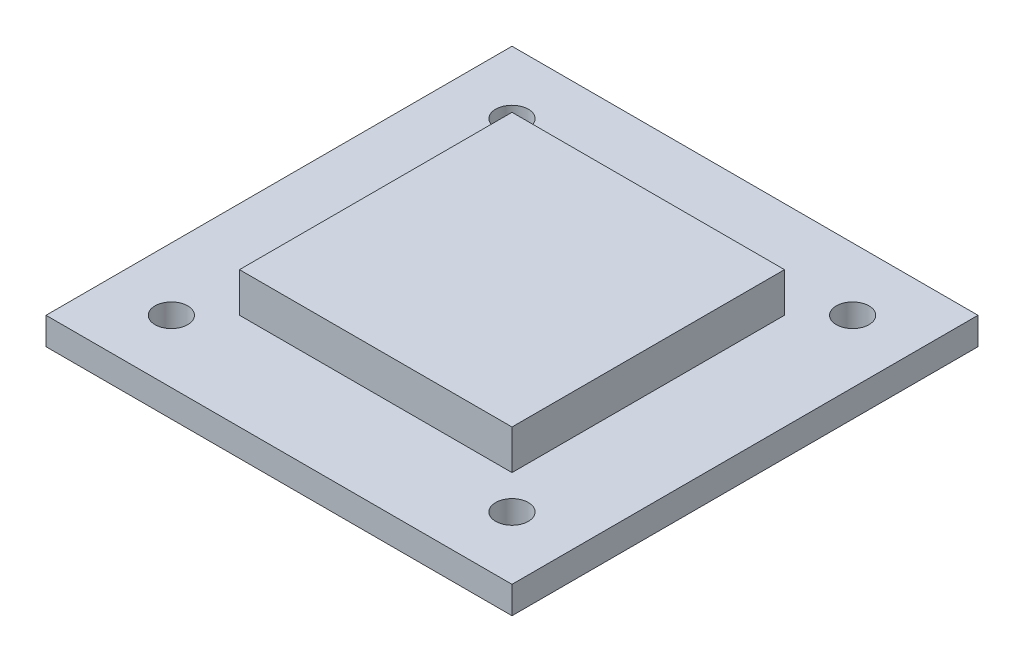
ISO-10303-21;
HEADER;
FILE_DESCRIPTION(('STEP AP214'),'2;1');
FILE_NAME('part.step','',(''),(''),'','','');
FILE_SCHEMA(('AUTOMOTIVE_DESIGN { 1 0 10303 214 1 1 1 1 }'));
ENDSEC;
DATA;
#1=APPLICATION_CONTEXT('core data for automotive mechanical design processes');
#2=APPLICATION_PROTOCOL_DEFINITION('international standard','automotive_design',2000,#1);
#3=PRODUCT_CONTEXT('',#1,'mechanical');
#4=PRODUCT('Part','Part','',(#3));
#5=PRODUCT_RELATED_PRODUCT_CATEGORY('part','',(#4));
#6=PRODUCT_DEFINITION_FORMATION('','',#4);
#7=PRODUCT_DEFINITION_CONTEXT('part definition',#1,'design');
#8=PRODUCT_DEFINITION('design','',#6,#7);
#9=PRODUCT_DEFINITION_SHAPE('','',#8);
#10=(LENGTH_UNIT() NAMED_UNIT(*) SI_UNIT(.MILLI.,.METRE.));
#11=(NAMED_UNIT(*) PLANE_ANGLE_UNIT() SI_UNIT($,.RADIAN.));
#12=(NAMED_UNIT(*) SI_UNIT($,.STERADIAN.) SOLID_ANGLE_UNIT());
#13=UNCERTAINTY_MEASURE_WITH_UNIT(LENGTH_MEASURE(1.E-05),#10,'distance_accuracy_value','');
#14=(GEOMETRIC_REPRESENTATION_CONTEXT(3) GLOBAL_UNCERTAINTY_ASSIGNED_CONTEXT((#13)) GLOBAL_UNIT_ASSIGNED_CONTEXT((#10,
#11,#12)) REPRESENTATION_CONTEXT('',''));
#15=CARTESIAN_POINT('',(0.,0.,0.));
#16=DIRECTION('',(0.,0.,1.));
#17=DIRECTION('',(1.,0.,0.));
#18=AXIS2_PLACEMENT_3D('',#15,#16,#17);
#19=CARTESIAN_POINT('',(-12.5,3.9,12.5));
#20=DIRECTION('',(0.,1.,0.));
#21=DIRECTION('',(0.,0.,1.));
#22=AXIS2_PLACEMENT_3D('',#19,#20,#21);
#23=CYLINDRICAL_SURFACE('',#22,1.19999999999999);
#24=CARTESIAN_POINT('',(-12.5,-1.,12.5));
#25=DIRECTION('',(0.,1.,0.));
#26=DIRECTION('',(0.,0.,1.));
#27=AXIS2_PLACEMENT_3D('',#24,#25,#26);
#28=CIRCLE('',#27,1.19999999999999);
#29=CARTESIAN_POINT('',(-12.5,-1.,13.7));
#30=VERTEX_POINT('',#29);
#31=EDGE_CURVE('E245',#30,#30,#28,.F.);
#32=ORIENTED_EDGE('',*,*,#31,.T.);
#33=EDGE_LOOP('',(#32));
#34=FACE_BOUND('',#33,.T.);
#35=CARTESIAN_POINT('',(-12.5,1.,12.5));
#36=DIRECTION('',(0.,1.,0.));
#37=DIRECTION('',(0.,0.,1.));
#38=AXIS2_PLACEMENT_3D('',#35,#36,#37);
#39=CIRCLE('',#38,1.19999999999999);
#40=CARTESIAN_POINT('',(-12.5,1.,13.7));
#41=VERTEX_POINT('',#40);
#42=EDGE_CURVE('E208',#41,#41,#39,.T.);
#43=ORIENTED_EDGE('',*,*,#42,.T.);
#44=EDGE_LOOP('',(#43));
#45=FACE_BOUND('',#44,.T.);
#46=ADVANCED_FACE('F41',(#34,#45),#23,.F.);
#47=CARTESIAN_POINT('',(12.5,3.9,-12.5));
#48=DIRECTION('',(0.,1.,0.));
#49=DIRECTION('',(0.,0.,1.));
#50=AXIS2_PLACEMENT_3D('',#47,#48,#49);
#51=CYLINDRICAL_SURFACE('',#50,1.19999999999999);
#52=CARTESIAN_POINT('',(12.5,-1.,-12.5));
#53=DIRECTION('',(0.,1.,0.));
#54=DIRECTION('',(0.,0.,1.));
#55=AXIS2_PLACEMENT_3D('',#52,#53,#54);
#56=CIRCLE('',#55,1.19999999999999);
#57=CARTESIAN_POINT('',(12.5,-1.,-11.3));
#58=VERTEX_POINT('',#57);
#59=EDGE_CURVE('E243',#58,#58,#56,.F.);
#60=ORIENTED_EDGE('',*,*,#59,.T.);
#61=EDGE_LOOP('',(#60));
#62=FACE_BOUND('',#61,.T.);
#63=CARTESIAN_POINT('',(12.5,1.,-12.5));
#64=DIRECTION('',(0.,1.,0.));
#65=DIRECTION('',(0.,0.,1.));
#66=AXIS2_PLACEMENT_3D('',#63,#64,#65);
#67=CIRCLE('',#66,1.19999999999999);
#68=CARTESIAN_POINT('',(12.5,1.,-11.3));
#69=VERTEX_POINT('',#68);
#70=EDGE_CURVE('E194',#69,#69,#67,.T.);
#71=ORIENTED_EDGE('',*,*,#70,.T.);
#72=EDGE_LOOP('',(#71));
#73=FACE_BOUND('',#72,.T.);
#74=ADVANCED_FACE('F267',(#62,#73),#51,.F.);
#75=CARTESIAN_POINT('',(12.5,3.9,12.5));
#76=DIRECTION('',(0.,1.,0.));
#77=DIRECTION('',(0.,0.,1.));
#78=AXIS2_PLACEMENT_3D('',#75,#76,#77);
#79=CYLINDRICAL_SURFACE('',#78,1.19999999999999);
#80=CARTESIAN_POINT('',(12.5,-1.,12.5));
#81=DIRECTION('',(0.,1.,0.));
#82=DIRECTION('',(0.,0.,1.));
#83=AXIS2_PLACEMENT_3D('',#80,#81,#82);
#84=CIRCLE('',#83,1.19999999999999);
#85=CARTESIAN_POINT('',(12.5,-1.,13.7));
#86=VERTEX_POINT('',#85);
#87=EDGE_CURVE('E143',#86,#86,#84,.F.);
#88=ORIENTED_EDGE('',*,*,#87,.T.);
#89=EDGE_LOOP('',(#88));
#90=FACE_BOUND('',#89,.T.);
#91=CARTESIAN_POINT('',(12.5,1.,12.5));
#92=DIRECTION('',(0.,1.,0.));
#93=DIRECTION('',(0.,0.,1.));
#94=AXIS2_PLACEMENT_3D('',#91,#92,#93);
#95=CIRCLE('',#94,1.19999999999999);
#96=CARTESIAN_POINT('',(12.5,1.,13.7));
#97=VERTEX_POINT('',#96);
#98=EDGE_CURVE('E211',#97,#97,#95,.T.);
#99=ORIENTED_EDGE('',*,*,#98,.T.);
#100=EDGE_LOOP('',(#99));
#101=FACE_BOUND('',#100,.T.);
#102=ADVANCED_FACE('F277',(#90,#101),#79,.F.);
#103=CARTESIAN_POINT('',(-12.5,3.9,-12.5));
#104=DIRECTION('',(0.,1.,0.));
#105=DIRECTION('',(0.,0.,1.));
#106=AXIS2_PLACEMENT_3D('',#103,#104,#105);
#107=CYLINDRICAL_SURFACE('',#106,1.19999999999999);
#108=CARTESIAN_POINT('',(-12.5,-1.,-12.5));
#109=DIRECTION('',(0.,1.,0.));
#110=DIRECTION('',(0.,0.,1.));
#111=AXIS2_PLACEMENT_3D('',#108,#109,#110);
#112=CIRCLE('',#111,1.19999999999999);
#113=CARTESIAN_POINT('',(-12.5,-1.,-11.3));
#114=VERTEX_POINT('',#113);
#115=EDGE_CURVE('E186',#114,#114,#112,.F.);
#116=ORIENTED_EDGE('',*,*,#115,.T.);
#117=EDGE_LOOP('',(#116));
#118=FACE_BOUND('',#117,.T.);
#119=CARTESIAN_POINT('',(-12.5,1.,-12.5));
#120=DIRECTION('',(0.,1.,0.));
#121=DIRECTION('',(0.,0.,1.));
#122=AXIS2_PLACEMENT_3D('',#119,#120,#121);
#123=CIRCLE('',#122,1.19999999999999);
#124=CARTESIAN_POINT('',(-12.5,1.,-11.3));
#125=VERTEX_POINT('',#124);
#126=EDGE_CURVE('E177',#125,#125,#123,.T.);
#127=ORIENTED_EDGE('',*,*,#126,.T.);
#128=EDGE_LOOP('',(#127));
#129=FACE_BOUND('',#128,.T.);
#130=ADVANCED_FACE('F322',(#118,#129),#107,.F.);
#131=CARTESIAN_POINT('',(17.1,3.9,-17.1));
#132=DIRECTION('',(-1.,0.,0.));
#133=DIRECTION('',(0.,0.,1.));
#134=AXIS2_PLACEMENT_3D('',#131,#132,#133);
#135=PLANE('',#134);
#136=DIRECTION('',(0.,-1.,0.));
#137=VECTOR('',#136,1.);
#138=CARTESIAN_POINT('',(17.1,3.9,17.1));
#139=LINE('',#138,#137);
#140=CARTESIAN_POINT('',(17.1,1.,17.1));
#141=VERTEX_POINT('',#140);
#142=CARTESIAN_POINT('',(17.1,-1.,17.1));
#143=VERTEX_POINT('',#142);
#144=EDGE_CURVE('E182',#141,#143,#139,.T.);
#145=ORIENTED_EDGE('',*,*,#144,.T.);
#146=DIRECTION('',(0.,0.,-1.));
#147=VECTOR('',#146,1.);
#148=CARTESIAN_POINT('',(17.1,-1.,0.));
#149=LINE('',#148,#147);
#150=CARTESIAN_POINT('',(17.1,-1.,-17.1));
#151=VERTEX_POINT('',#150);
#152=EDGE_CURVE('E57',#143,#151,#149,.T.);
#153=ORIENTED_EDGE('',*,*,#152,.T.);
#154=DIRECTION('',(0.,-1.,0.));
#155=VECTOR('',#154,1.);
#156=CARTESIAN_POINT('',(17.1,3.9,-17.1));
#157=LINE('',#156,#155);
#158=CARTESIAN_POINT('',(17.1,1.,-17.1));
#159=VERTEX_POINT('',#158);
#160=EDGE_CURVE('E12',#159,#151,#157,.T.);
#161=ORIENTED_EDGE('',*,*,#160,.F.);
#162=DIRECTION('',(0.,0.,1.));
#163=VECTOR('',#162,1.);
#164=CARTESIAN_POINT('',(17.1,1.,0.));
#165=LINE('',#164,#163);
#166=EDGE_CURVE('E202',#159,#141,#165,.T.);
#167=ORIENTED_EDGE('',*,*,#166,.T.);
#168=EDGE_LOOP('',(#145,#153,#161,#167));
#169=FACE_BOUND('',#168,.T.);
#170=ADVANCED_FACE('F43',(#169),#135,.F.);
#171=CARTESIAN_POINT('',(-17.1,3.9,-17.1));
#172=DIRECTION('',(0.,0.,1.));
#173=DIRECTION('',(1.,0.,0.));
#174=AXIS2_PLACEMENT_3D('',#171,#172,#173);
#175=PLANE('',#174);
#176=ORIENTED_EDGE('',*,*,#160,.T.);
#177=DIRECTION('',(-1.,0.,0.));
#178=VECTOR('',#177,1.);
#179=CARTESIAN_POINT('',(0.,-1.,-17.1));
#180=LINE('',#179,#178);
#181=CARTESIAN_POINT('',(-17.1,-1.,-17.1));
#182=VERTEX_POINT('',#181);
#183=EDGE_CURVE('E234',#151,#182,#180,.T.);
#184=ORIENTED_EDGE('',*,*,#183,.T.);
#185=DIRECTION('',(0.,-1.,0.));
#186=VECTOR('',#185,1.);
#187=CARTESIAN_POINT('',(-17.1,3.9,-17.1));
#188=LINE('',#187,#186);
#189=CARTESIAN_POINT('',(-17.1,1.,-17.1));
#190=VERTEX_POINT('',#189);
#191=EDGE_CURVE('E47',#190,#182,#188,.T.);
#192=ORIENTED_EDGE('',*,*,#191,.F.);
#193=DIRECTION('',(1.,0.,0.));
#194=VECTOR('',#193,1.);
#195=CARTESIAN_POINT('',(0.,1.,-17.1));
#196=LINE('',#195,#194);
#197=EDGE_CURVE('E205',#190,#159,#196,.T.);
#198=ORIENTED_EDGE('',*,*,#197,.T.);
#199=EDGE_LOOP('',(#176,#184,#192,#198));
#200=FACE_BOUND('',#199,.T.);
#201=ADVANCED_FACE('F232',(#200),#175,.F.);
#202=CARTESIAN_POINT('',(-17.1,3.9,-17.1));
#203=DIRECTION('',(1.,0.,0.));
#204=DIRECTION('',(0.,0.,-1.));
#205=AXIS2_PLACEMENT_3D('',#202,#203,#204);
#206=PLANE('',#205);
#207=ORIENTED_EDGE('',*,*,#191,.T.);
#208=DIRECTION('',(0.,0.,1.));
#209=VECTOR('',#208,1.);
#210=CARTESIAN_POINT('',(-17.1,-1.,0.));
#211=LINE('',#210,#209);
#212=CARTESIAN_POINT('',(-17.1,-1.,17.1));
#213=VERTEX_POINT('',#212);
#214=EDGE_CURVE('E147',#182,#213,#211,.T.);
#215=ORIENTED_EDGE('',*,*,#214,.T.);
#216=DIRECTION('',(0.,-1.,0.));
#217=VECTOR('',#216,1.);
#218=CARTESIAN_POINT('',(-17.1,3.9,17.1));
#219=LINE('',#218,#217);
#220=CARTESIAN_POINT('',(-17.1,1.,17.1));
#221=VERTEX_POINT('',#220);
#222=EDGE_CURVE('E222',#221,#213,#219,.T.);
#223=ORIENTED_EDGE('',*,*,#222,.F.);
#224=DIRECTION('',(0.,0.,-1.));
#225=VECTOR('',#224,1.);
#226=CARTESIAN_POINT('',(-17.1,1.,0.));
#227=LINE('',#226,#225);
#228=EDGE_CURVE('E200',#221,#190,#227,.T.);
#229=ORIENTED_EDGE('',*,*,#228,.T.);
#230=EDGE_LOOP('',(#207,#215,#223,#229));
#231=FACE_BOUND('',#230,.T.);
#232=ADVANCED_FACE('F229',(#231),#206,.F.);
#233=CARTESIAN_POINT('',(-17.1,3.9,17.1));
#234=DIRECTION('',(0.,0.,-1.));
#235=DIRECTION('',(-1.,0.,0.));
#236=AXIS2_PLACEMENT_3D('',#233,#234,#235);
#237=PLANE('',#236);
#238=ORIENTED_EDGE('',*,*,#222,.T.);
#239=DIRECTION('',(1.,0.,0.));
#240=VECTOR('',#239,1.);
#241=CARTESIAN_POINT('',(0.,-1.,17.1));
#242=LINE('',#241,#240);
#243=EDGE_CURVE('E233',#213,#143,#242,.T.);
#244=ORIENTED_EDGE('',*,*,#243,.T.);
#245=ORIENTED_EDGE('',*,*,#144,.F.);
#246=DIRECTION('',(-1.,0.,0.));
#247=VECTOR('',#246,1.);
#248=CARTESIAN_POINT('',(0.,1.,17.1));
#249=LINE('',#248,#247);
#250=EDGE_CURVE('E198',#141,#221,#249,.T.);
#251=ORIENTED_EDGE('',*,*,#250,.T.);
#252=EDGE_LOOP('',(#238,#244,#245,#251));
#253=FACE_BOUND('',#252,.T.);
#254=ADVANCED_FACE('F325',(#253),#237,.F.);
#255=CARTESIAN_POINT('',(0.,-48.3661038331599,10.));
#256=DIRECTION('',(0.,0.,-1.));
#257=DIRECTION('',(-1.,0.,0.));
#258=AXIS2_PLACEMENT_3D('',#255,#256,#257);
#259=PLANE('',#258);
#260=DIRECTION('',(1.,0.,0.));
#261=VECTOR('',#260,1.);
#262=CARTESIAN_POINT('',(0.,1.,10.));
#263=LINE('',#262,#261);
#264=CARTESIAN_POINT('',(-10.,1.,10.));
#265=VERTEX_POINT('',#264);
#266=CARTESIAN_POINT('',(10.,1.,10.));
#267=VERTEX_POINT('',#266);
#268=EDGE_CURVE('E185',#265,#267,#263,.T.);
#269=ORIENTED_EDGE('',*,*,#268,.T.);
#270=DIRECTION('',(0.,1.,0.));
#271=VECTOR('',#270,1.);
#272=CARTESIAN_POINT('',(10.,-48.3661038331599,10.));
#273=LINE('',#272,#271);
#274=CARTESIAN_POINT('',(10.,3.9,10.));
#275=VERTEX_POINT('',#274);
#276=EDGE_CURVE('E170',#267,#275,#273,.T.);
#277=ORIENTED_EDGE('',*,*,#276,.T.);
#278=DIRECTION('',(-1.,0.,0.));
#279=VECTOR('',#278,1.);
#280=CARTESIAN_POINT('',(0.,3.9,10.));
#281=LINE('',#280,#279);
#282=CARTESIAN_POINT('',(-10.,3.9,10.));
#283=VERTEX_POINT('',#282);
#284=EDGE_CURVE('E180',#275,#283,#281,.T.);
#285=ORIENTED_EDGE('',*,*,#284,.T.);
#286=DIRECTION('',(0.,1.,0.));
#287=VECTOR('',#286,1.);
#288=CARTESIAN_POINT('',(-10.,-48.3661038331599,10.));
#289=LINE('',#288,#287);
#290=EDGE_CURVE('E189',#265,#283,#289,.T.);
#291=ORIENTED_EDGE('',*,*,#290,.F.);
#292=EDGE_LOOP('',(#269,#277,#285,#291));
#293=FACE_BOUND('',#292,.T.);
#294=ADVANCED_FACE('F297',(#293),#259,.F.);
#295=CARTESIAN_POINT('',(10.,-48.3661038331599,0.));
#296=DIRECTION('',(1.,0.,0.));
#297=DIRECTION('',(0.,0.,-1.));
#298=AXIS2_PLACEMENT_3D('',#295,#296,#297);
#299=PLANE('',#298);
#300=DIRECTION('',(0.,1.,0.));
#301=VECTOR('',#300,1.);
#302=CARTESIAN_POINT('',(10.,-48.3661038331599,-10.));
#303=LINE('',#302,#301);
#304=CARTESIAN_POINT('',(10.,1.,-10.));
#305=VERTEX_POINT('',#304);
#306=CARTESIAN_POINT('',(10.,3.9,-10.));
#307=VERTEX_POINT('',#306);
#308=EDGE_CURVE('E174',#305,#307,#303,.T.);
#309=ORIENTED_EDGE('',*,*,#308,.T.);
#310=DIRECTION('',(0.,0.,-1.));
#311=VECTOR('',#310,1.);
#312=CARTESIAN_POINT('',(10.,3.9,0.));
#313=LINE('',#312,#311);
#314=EDGE_CURVE('E162',#275,#307,#313,.T.);
#315=ORIENTED_EDGE('',*,*,#314,.F.);
#316=ORIENTED_EDGE('',*,*,#276,.F.);
#317=DIRECTION('',(0.,0.,1.));
#318=VECTOR('',#317,1.);
#319=CARTESIAN_POINT('',(10.,1.,0.));
#320=LINE('',#319,#318);
#321=EDGE_CURVE('E184',#305,#267,#320,.T.);
#322=ORIENTED_EDGE('',*,*,#321,.F.);
#323=EDGE_LOOP('',(#309,#315,#316,#322));
#324=FACE_BOUND('',#323,.T.);
#325=ADVANCED_FACE('F307',(#324),#299,.T.);
#326=CARTESIAN_POINT('',(0.,-48.3661038331599,-10.));
#327=DIRECTION('',(0.,0.,-1.));
#328=DIRECTION('',(-1.,0.,0.));
#329=AXIS2_PLACEMENT_3D('',#326,#327,#328);
#330=PLANE('',#329);
#331=DIRECTION('',(0.,1.,0.));
#332=VECTOR('',#331,1.);
#333=CARTESIAN_POINT('',(-10.,-48.3661038331599,-10.));
#334=LINE('',#333,#332);
#335=CARTESIAN_POINT('',(-10.,1.,-10.));
#336=VERTEX_POINT('',#335);
#337=CARTESIAN_POINT('',(-10.,3.9,-10.));
#338=VERTEX_POINT('',#337);
#339=EDGE_CURVE('E173',#336,#338,#334,.T.);
#340=ORIENTED_EDGE('',*,*,#339,.T.);
#341=DIRECTION('',(-1.,0.,0.));
#342=VECTOR('',#341,1.);
#343=CARTESIAN_POINT('',(0.,3.9,-10.));
#344=LINE('',#343,#342);
#345=EDGE_CURVE('E169',#307,#338,#344,.T.);
#346=ORIENTED_EDGE('',*,*,#345,.F.);
#347=ORIENTED_EDGE('',*,*,#308,.F.);
#348=DIRECTION('',(1.,0.,0.));
#349=VECTOR('',#348,1.);
#350=CARTESIAN_POINT('',(0.,1.,-10.));
#351=LINE('',#350,#349);
#352=EDGE_CURVE('E167',#336,#305,#351,.T.);
#353=ORIENTED_EDGE('',*,*,#352,.F.);
#354=EDGE_LOOP('',(#340,#346,#347,#353));
#355=FACE_BOUND('',#354,.T.);
#356=ADVANCED_FACE('F309',(#355),#330,.T.);
#357=CARTESIAN_POINT('',(-10.,-48.3661038331599,0.));
#358=DIRECTION('',(1.,0.,0.));
#359=DIRECTION('',(0.,0.,-1.));
#360=AXIS2_PLACEMENT_3D('',#357,#358,#359);
#361=PLANE('',#360);
#362=DIRECTION('',(0.,0.,1.));
#363=VECTOR('',#362,1.);
#364=CARTESIAN_POINT('',(-10.,1.,0.));
#365=LINE('',#364,#363);
#366=EDGE_CURVE('E176',#336,#265,#365,.T.);
#367=ORIENTED_EDGE('',*,*,#366,.T.);
#368=ORIENTED_EDGE('',*,*,#290,.T.);
#369=DIRECTION('',(0.,0.,-1.));
#370=VECTOR('',#369,1.);
#371=CARTESIAN_POINT('',(-10.,3.9,0.));
#372=LINE('',#371,#370);
#373=EDGE_CURVE('E172',#283,#338,#372,.T.);
#374=ORIENTED_EDGE('',*,*,#373,.T.);
#375=ORIENTED_EDGE('',*,*,#339,.F.);
#376=EDGE_LOOP('',(#367,#368,#374,#375));
#377=FACE_BOUND('',#376,.T.);
#378=ADVANCED_FACE('F288',(#377),#361,.F.);
#379=CARTESIAN_POINT('',(0.,1.,0.));
#380=DIRECTION('',(0.,1.,0.));
#381=DIRECTION('',(0.,0.,1.));
#382=AXIS2_PLACEMENT_3D('',#379,#380,#381);
#383=PLANE('',#382);
#384=ORIENTED_EDGE('',*,*,#126,.F.);
#385=EDGE_LOOP('',(#384));
#386=FACE_BOUND('',#385,.T.);
#387=ORIENTED_EDGE('',*,*,#70,.F.);
#388=EDGE_LOOP('',(#387));
#389=FACE_BOUND('',#388,.T.);
#390=ORIENTED_EDGE('',*,*,#250,.F.);
#391=ORIENTED_EDGE('',*,*,#166,.F.);
#392=ORIENTED_EDGE('',*,*,#197,.F.);
#393=ORIENTED_EDGE('',*,*,#228,.F.);
#394=EDGE_LOOP('',(#390,#391,#392,#393));
#395=FACE_BOUND('',#394,.T.);
#396=ORIENTED_EDGE('',*,*,#42,.F.);
#397=EDGE_LOOP('',(#396));
#398=FACE_BOUND('',#397,.T.);
#399=ORIENTED_EDGE('',*,*,#98,.F.);
#400=EDGE_LOOP('',(#399));
#401=FACE_BOUND('',#400,.T.);
#402=ORIENTED_EDGE('',*,*,#268,.F.);
#403=ORIENTED_EDGE('',*,*,#366,.F.);
#404=ORIENTED_EDGE('',*,*,#352,.T.);
#405=ORIENTED_EDGE('',*,*,#321,.T.);
#406=EDGE_LOOP('',(#402,#403,#404,#405));
#407=FACE_BOUND('',#406,.T.);
#408=ADVANCED_FACE('F282',(#386,#389,#395,#398,#401,#407),#383,.T.);
#409=CARTESIAN_POINT('',(0.,3.9,0.));
#410=DIRECTION('',(0.,1.,0.));
#411=DIRECTION('',(0.,0.,1.));
#412=AXIS2_PLACEMENT_3D('',#409,#410,#411);
#413=PLANE('',#412);
#414=ORIENTED_EDGE('',*,*,#284,.F.);
#415=ORIENTED_EDGE('',*,*,#314,.T.);
#416=ORIENTED_EDGE('',*,*,#345,.T.);
#417=ORIENTED_EDGE('',*,*,#373,.F.);
#418=EDGE_LOOP('',(#414,#415,#416,#417));
#419=FACE_BOUND('',#418,.T.);
#420=ADVANCED_FACE('F284',(#419),#413,.T.);
#421=CARTESIAN_POINT('',(10.,48.3661038331599,0.));
#422=DIRECTION('',(-1.,0.,0.));
#423=DIRECTION('',(0.,0.,1.));
#424=AXIS2_PLACEMENT_3D('',#421,#422,#423);
#425=PLANE('',#424);
#426=DIRECTION('',(0.,-1.,0.));
#427=VECTOR('',#426,1.);
#428=CARTESIAN_POINT('',(10.,48.3661038331599,10.));
#429=LINE('',#428,#427);
#430=CARTESIAN_POINT('',(10.,-1.,10.));
#431=VERTEX_POINT('',#430);
#432=CARTESIAN_POINT('',(10.,-3.9,10.));
#433=VERTEX_POINT('',#432);
#434=EDGE_CURVE('E137',#431,#433,#429,.T.);
#435=ORIENTED_EDGE('',*,*,#434,.T.);
#436=DIRECTION('',(0.,0.,-1.));
#437=VECTOR('',#436,1.);
#438=CARTESIAN_POINT('',(10.,-3.9,0.));
#439=LINE('',#438,#437);
#440=CARTESIAN_POINT('',(10.,-3.9,-10.));
#441=VERTEX_POINT('',#440);
#442=EDGE_CURVE('E249',#433,#441,#439,.T.);
#443=ORIENTED_EDGE('',*,*,#442,.T.);
#444=DIRECTION('',(0.,-1.,0.));
#445=VECTOR('',#444,1.);
#446=CARTESIAN_POINT('',(10.,48.3661038331599,-10.));
#447=LINE('',#446,#445);
#448=CARTESIAN_POINT('',(10.,-1.,-10.));
#449=VERTEX_POINT('',#448);
#450=EDGE_CURVE('E139',#449,#441,#447,.T.);
#451=ORIENTED_EDGE('',*,*,#450,.F.);
#452=DIRECTION('',(0.,0.,-1.));
#453=VECTOR('',#452,1.);
#454=CARTESIAN_POINT('',(10.,-1.,0.));
#455=LINE('',#454,#453);
#456=EDGE_CURVE('E133',#431,#449,#455,.T.);
#457=ORIENTED_EDGE('',*,*,#456,.F.);
#458=EDGE_LOOP('',(#435,#443,#451,#457));
#459=FACE_BOUND('',#458,.T.);
#460=ADVANCED_FACE('F132',(#459),#425,.F.);
#461=CARTESIAN_POINT('',(0.,48.3661038331599,-10.));
#462=DIRECTION('',(0.,0.,1.));
#463=DIRECTION('',(1.,0.,0.));
#464=AXIS2_PLACEMENT_3D('',#461,#462,#463);
#465=PLANE('',#464);
#466=ORIENTED_EDGE('',*,*,#450,.T.);
#467=DIRECTION('',(-1.,0.,0.));
#468=VECTOR('',#467,1.);
#469=CARTESIAN_POINT('',(0.,-3.9,-10.));
#470=LINE('',#469,#468);
#471=CARTESIAN_POINT('',(-10.,-3.9,-10.));
#472=VERTEX_POINT('',#471);
#473=EDGE_CURVE('E157',#441,#472,#470,.T.);
#474=ORIENTED_EDGE('',*,*,#473,.T.);
#475=DIRECTION('',(0.,-1.,0.));
#476=VECTOR('',#475,1.);
#477=CARTESIAN_POINT('',(-10.,48.3661038331599,-10.));
#478=LINE('',#477,#476);
#479=CARTESIAN_POINT('',(-10.,-1.,-10.));
#480=VERTEX_POINT('',#479);
#481=EDGE_CURVE('E160',#480,#472,#478,.T.);
#482=ORIENTED_EDGE('',*,*,#481,.F.);
#483=DIRECTION('',(-1.,0.,0.));
#484=VECTOR('',#483,1.);
#485=CARTESIAN_POINT('',(0.,-1.,-10.));
#486=LINE('',#485,#484);
#487=EDGE_CURVE('E340',#449,#480,#486,.T.);
#488=ORIENTED_EDGE('',*,*,#487,.F.);
#489=EDGE_LOOP('',(#466,#474,#482,#488));
#490=FACE_BOUND('',#489,.T.);
#491=ADVANCED_FACE('F258',(#490),#465,.F.);
#492=CARTESIAN_POINT('',(-10.,48.3661038331599,0.));
#493=DIRECTION('',(-1.,0.,0.));
#494=DIRECTION('',(0.,0.,1.));
#495=AXIS2_PLACEMENT_3D('',#492,#493,#494);
#496=PLANE('',#495);
#497=DIRECTION('',(0.,0.,-1.));
#498=VECTOR('',#497,1.);
#499=CARTESIAN_POINT('',(-10.,-1.,0.));
#500=LINE('',#499,#498);
#501=CARTESIAN_POINT('',(-10.,-1.,10.));
#502=VERTEX_POINT('',#501);
#503=EDGE_CURVE('E146',#502,#480,#500,.T.);
#504=ORIENTED_EDGE('',*,*,#503,.T.);
#505=ORIENTED_EDGE('',*,*,#481,.T.);
#506=DIRECTION('',(0.,0.,-1.));
#507=VECTOR('',#506,1.);
#508=CARTESIAN_POINT('',(-10.,-3.9,0.));
#509=LINE('',#508,#507);
#510=CARTESIAN_POINT('',(-10.,-3.9,10.));
#511=VERTEX_POINT('',#510);
#512=EDGE_CURVE('E65',#511,#472,#509,.T.);
#513=ORIENTED_EDGE('',*,*,#512,.F.);
#514=DIRECTION('',(0.,-1.,0.));
#515=VECTOR('',#514,1.);
#516=CARTESIAN_POINT('',(-10.,48.3661038331599,10.));
#517=LINE('',#516,#515);
#518=EDGE_CURVE('E142',#502,#511,#517,.T.);
#519=ORIENTED_EDGE('',*,*,#518,.F.);
#520=EDGE_LOOP('',(#504,#505,#513,#519));
#521=FACE_BOUND('',#520,.T.);
#522=ADVANCED_FACE('F251',(#521),#496,.T.);
#523=CARTESIAN_POINT('',(0.,48.3661038331599,10.));
#524=DIRECTION('',(0.,0.,1.));
#525=DIRECTION('',(1.,0.,0.));
#526=AXIS2_PLACEMENT_3D('',#523,#524,#525);
#527=PLANE('',#526);
#528=DIRECTION('',(-1.,0.,0.));
#529=VECTOR('',#528,1.);
#530=CARTESIAN_POINT('',(0.,-1.,10.));
#531=LINE('',#530,#529);
#532=EDGE_CURVE('E144',#431,#502,#531,.T.);
#533=ORIENTED_EDGE('',*,*,#532,.T.);
#534=ORIENTED_EDGE('',*,*,#518,.T.);
#535=DIRECTION('',(-1.,0.,0.));
#536=VECTOR('',#535,1.);
#537=CARTESIAN_POINT('',(0.,-3.9,10.));
#538=LINE('',#537,#536);
#539=EDGE_CURVE('E152',#433,#511,#538,.T.);
#540=ORIENTED_EDGE('',*,*,#539,.F.);
#541=ORIENTED_EDGE('',*,*,#434,.F.);
#542=EDGE_LOOP('',(#533,#534,#540,#541));
#543=FACE_BOUND('',#542,.T.);
#544=ADVANCED_FACE('F155',(#543),#527,.T.);
#545=CARTESIAN_POINT('',(0.,-1.,0.));
#546=DIRECTION('',(0.,1.,0.));
#547=DIRECTION('',(0.,0.,1.));
#548=AXIS2_PLACEMENT_3D('',#545,#546,#547);
#549=PLANE('',#548);
#550=ORIENTED_EDGE('',*,*,#59,.F.);
#551=EDGE_LOOP('',(#550));
#552=FACE_BOUND('',#551,.T.);
#553=ORIENTED_EDGE('',*,*,#31,.F.);
#554=EDGE_LOOP('',(#553));
#555=FACE_BOUND('',#554,.T.);
#556=ORIENTED_EDGE('',*,*,#456,.T.);
#557=ORIENTED_EDGE('',*,*,#487,.T.);
#558=ORIENTED_EDGE('',*,*,#503,.F.);
#559=ORIENTED_EDGE('',*,*,#532,.F.);
#560=EDGE_LOOP('',(#556,#557,#558,#559));
#561=FACE_BOUND('',#560,.T.);
#562=ORIENTED_EDGE('',*,*,#87,.F.);
#563=EDGE_LOOP('',(#562));
#564=FACE_BOUND('',#563,.T.);
#565=ORIENTED_EDGE('',*,*,#214,.F.);
#566=ORIENTED_EDGE('',*,*,#183,.F.);
#567=ORIENTED_EDGE('',*,*,#152,.F.);
#568=ORIENTED_EDGE('',*,*,#243,.F.);
#569=EDGE_LOOP('',(#565,#566,#567,#568));
#570=FACE_BOUND('',#569,.T.);
#571=ORIENTED_EDGE('',*,*,#115,.F.);
#572=EDGE_LOOP('',(#571));
#573=FACE_BOUND('',#572,.T.);
#574=ADVANCED_FACE('F148',(#552,#555,#561,#564,#570,#573),#549,.F.);
#575=CARTESIAN_POINT('',(0.,-3.9,0.));
#576=DIRECTION('',(0.,1.,0.));
#577=DIRECTION('',(0.,0.,1.));
#578=AXIS2_PLACEMENT_3D('',#575,#576,#577);
#579=PLANE('',#578);
#580=ORIENTED_EDGE('',*,*,#473,.F.);
#581=ORIENTED_EDGE('',*,*,#442,.F.);
#582=ORIENTED_EDGE('',*,*,#539,.T.);
#583=ORIENTED_EDGE('',*,*,#512,.T.);
#584=EDGE_LOOP('',(#580,#581,#582,#583));
#585=FACE_BOUND('',#584,.T.);
#586=ADVANCED_FACE('F256',(#585),#579,.F.);
#587=CLOSED_SHELL('',(#46,#74,#102,#130,#170,#201,#232,#254,#294,#325,#356,#378,#408,#420,#460,
#491,#522,#544,#574,#586));
#588=MANIFOLD_SOLID_BREP('B2',#587);
#589=ADVANCED_BREP_SHAPE_REPRESENTATION('',(#18,#588),#14);
#590=SHAPE_DEFINITION_REPRESENTATION(#9,#589);
ENDSEC;
END-ISO-10303-21;
